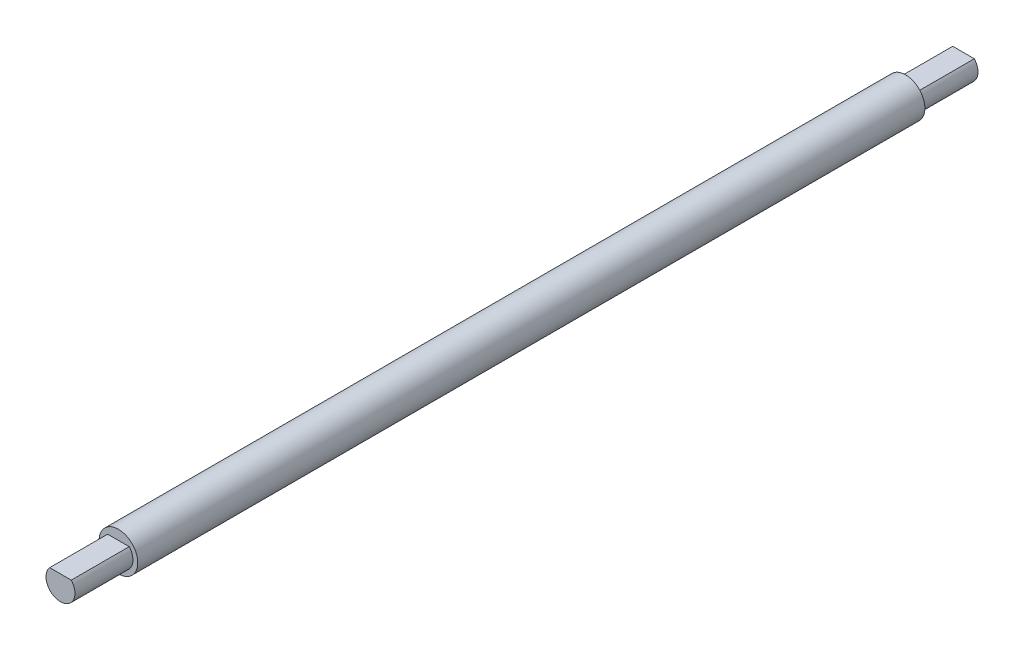
ISO-10303-21;
HEADER;
FILE_DESCRIPTION(('STEP AP214'),'2;1');
FILE_NAME('part.step','',(''),(''),'','','');
FILE_SCHEMA(('AUTOMOTIVE_DESIGN { 1 0 10303 214 1 1 1 1 }'));
ENDSEC;
DATA;
#1=APPLICATION_CONTEXT('core data for automotive mechanical design processes');
#2=APPLICATION_PROTOCOL_DEFINITION('international standard','automotive_design',2000,#1);
#3=PRODUCT_CONTEXT('',#1,'mechanical');
#4=PRODUCT('Part','Part','',(#3));
#5=PRODUCT_RELATED_PRODUCT_CATEGORY('part','',(#4));
#6=PRODUCT_DEFINITION_FORMATION('','',#4);
#7=PRODUCT_DEFINITION_CONTEXT('part definition',#1,'design');
#8=PRODUCT_DEFINITION('design','',#6,#7);
#9=PRODUCT_DEFINITION_SHAPE('','',#8);
#10=(LENGTH_UNIT() NAMED_UNIT(*) SI_UNIT(.MILLI.,.METRE.));
#11=(NAMED_UNIT(*) PLANE_ANGLE_UNIT() SI_UNIT($,.RADIAN.));
#12=(NAMED_UNIT(*) SI_UNIT($,.STERADIAN.) SOLID_ANGLE_UNIT());
#13=UNCERTAINTY_MEASURE_WITH_UNIT(LENGTH_MEASURE(1.E-05),#10,'distance_accuracy_value','');
#14=(GEOMETRIC_REPRESENTATION_CONTEXT(3) GLOBAL_UNCERTAINTY_ASSIGNED_CONTEXT((#13)) GLOBAL_UNIT_ASSIGNED_CONTEXT((#10,
#11,#12)) REPRESENTATION_CONTEXT('',''));
#15=CARTESIAN_POINT('',(0.,0.,0.));
#16=DIRECTION('',(0.,0.,1.));
#17=DIRECTION('',(1.,0.,0.));
#18=AXIS2_PLACEMENT_3D('',#15,#16,#17);
#19=CARTESIAN_POINT('',(0.,0.,0.));
#20=DIRECTION('',(0.,0.,1.));
#21=DIRECTION('',(1.,0.,0.));
#22=AXIS2_PLACEMENT_3D('',#19,#20,#21);
#23=PLANE('',#22);
#24=DIRECTION('',(1.,0.,0.));
#25=VECTOR('',#24,1.);
#26=CARTESIAN_POINT('',(-4.,2.00000000000003,0.));
#27=LINE('',#26,#25);
#28=CARTESIAN_POINT('',(-2.23606797749976,2.00000000000003,0.));
#29=VERTEX_POINT('',#28);
#30=CARTESIAN_POINT('',(2.23606797749976,2.00000000000003,0.));
#31=VERTEX_POINT('',#30);
#32=EDGE_CURVE('E86',#29,#31,#27,.T.);
#33=ORIENTED_EDGE('',*,*,#32,.T.);
#34=CARTESIAN_POINT('',(0.,0.,0.));
#35=DIRECTION('',(0.,0.,-1.));
#36=DIRECTION('',(-1.,0.,0.));
#37=AXIS2_PLACEMENT_3D('',#34,#35,#36);
#38=CIRCLE('',#37,3.);
#39=EDGE_CURVE('E49',#31,#29,#38,.T.);
#40=ORIENTED_EDGE('',*,*,#39,.T.);
#41=EDGE_LOOP('',(#33,#40));
#42=FACE_BOUND('',#41,.T.);
#43=ADVANCED_FACE('F35',(#42),#23,.F.);
#44=CARTESIAN_POINT('',(0.,0.,0.));
#45=DIRECTION('',(0.,0.,1.));
#46=DIRECTION('',(1.,0.,0.));
#47=AXIS2_PLACEMENT_3D('',#44,#45,#46);
#48=CYLINDRICAL_SURFACE('',#47,4.);
#49=CARTESIAN_POINT('',(0.,0.,12.));
#50=DIRECTION('',(0.,0.,1.));
#51=DIRECTION('',(1.,0.,0.));
#52=AXIS2_PLACEMENT_3D('',#49,#50,#51);
#53=CIRCLE('',#52,4.);
#54=CARTESIAN_POINT('',(4.,0.,12.));
#55=VERTEX_POINT('',#54);
#56=EDGE_CURVE('E104',#55,#55,#53,.F.);
#57=ORIENTED_EDGE('',*,*,#56,.F.);
#58=EDGE_LOOP('',(#57));
#59=FACE_BOUND('',#58,.T.);
#60=CARTESIAN_POINT('',(0.,0.,175.));
#61=DIRECTION('',(0.,0.,-1.));
#62=DIRECTION('',(-1.,0.,0.));
#63=AXIS2_PLACEMENT_3D('',#60,#61,#62);
#64=CIRCLE('',#63,4.);
#65=CARTESIAN_POINT('',(-4.,0.,175.));
#66=VERTEX_POINT('',#65);
#67=EDGE_CURVE('E101',#66,#66,#64,.F.);
#68=ORIENTED_EDGE('',*,*,#67,.F.);
#69=EDGE_LOOP('',(#68));
#70=FACE_BOUND('',#69,.T.);
#71=ADVANCED_FACE('F120',(#59,#70),#48,.T.);
#72=CARTESIAN_POINT('',(0.,0.,187.));
#73=DIRECTION('',(0.,0.,1.));
#74=DIRECTION('',(1.,0.,0.));
#75=AXIS2_PLACEMENT_3D('',#72,#73,#74);
#76=PLANE('',#75);
#77=CARTESIAN_POINT('',(0.,0.,187.));
#78=DIRECTION('',(0.,0.,-1.));
#79=DIRECTION('',(-1.,0.,0.));
#80=AXIS2_PLACEMENT_3D('',#77,#78,#79);
#81=CIRCLE('',#80,2.99999999999998);
#82=CARTESIAN_POINT('',(2.23606797749976,2.,187.));
#83=VERTEX_POINT('',#82);
#84=CARTESIAN_POINT('',(-2.23606797749976,2.,187.));
#85=VERTEX_POINT('',#84);
#86=EDGE_CURVE('E81',#83,#85,#81,.T.);
#87=ORIENTED_EDGE('',*,*,#86,.F.);
#88=DIRECTION('',(1.,0.,0.));
#89=VECTOR('',#88,1.);
#90=CARTESIAN_POINT('',(0.,2.,187.));
#91=LINE('',#90,#89);
#92=EDGE_CURVE('E93',#85,#83,#91,.T.);
#93=ORIENTED_EDGE('',*,*,#92,.F.);
#94=EDGE_LOOP('',(#87,#93));
#95=FACE_BOUND('',#94,.T.);
#96=ADVANCED_FACE('F118',(#95),#76,.T.);
#97=CARTESIAN_POINT('',(-4.,2.,175.));
#98=DIRECTION('',(0.,0.,-1.));
#99=DIRECTION('',(-1.,0.,0.));
#100=AXIS2_PLACEMENT_3D('',#97,#98,#99);
#101=PLANE('',#100);
#102=DIRECTION('',(1.,0.,0.));
#103=VECTOR('',#102,1.);
#104=CARTESIAN_POINT('',(-4.,2.,175.));
#105=LINE('',#104,#103);
#106=CARTESIAN_POINT('',(-2.23606797749976,2.,175.));
#107=VERTEX_POINT('',#106);
#108=CARTESIAN_POINT('',(2.23606797749976,2.,175.));
#109=VERTEX_POINT('',#108);
#110=EDGE_CURVE('E89',#107,#109,#105,.T.);
#111=ORIENTED_EDGE('',*,*,#110,.T.);
#112=CARTESIAN_POINT('',(0.,0.,175.));
#113=DIRECTION('',(0.,0.,-1.));
#114=DIRECTION('',(-1.,0.,0.));
#115=AXIS2_PLACEMENT_3D('',#112,#113,#114);
#116=CIRCLE('',#115,2.99999999999998);
#117=EDGE_CURVE('E57',#109,#107,#116,.T.);
#118=ORIENTED_EDGE('',*,*,#117,.T.);
#119=EDGE_LOOP('',(#111,#118));
#120=FACE_BOUND('',#119,.T.);
#121=ORIENTED_EDGE('',*,*,#67,.T.);
#122=EDGE_LOOP('',(#121));
#123=FACE_BOUND('',#122,.T.);
#124=ADVANCED_FACE('F112',(#120,#123),#101,.F.);
#125=CARTESIAN_POINT('',(-4.,2.,187.));
#126=DIRECTION('',(0.,-1.,0.));
#127=DIRECTION('',(0.,0.,-1.));
#128=AXIS2_PLACEMENT_3D('',#125,#126,#127);
#129=PLANE('',#128);
#130=ORIENTED_EDGE('',*,*,#110,.F.);
#131=DIRECTION('',(0.,0.,-1.));
#132=VECTOR('',#131,1.);
#133=CARTESIAN_POINT('',(-2.23606797749976,2.,0.));
#134=LINE('',#133,#132);
#135=EDGE_CURVE('E11',#107,#85,#134,.F.);
#136=ORIENTED_EDGE('',*,*,#135,.T.);
#137=ORIENTED_EDGE('',*,*,#92,.T.);
#138=DIRECTION('',(0.,0.,-1.));
#139=VECTOR('',#138,1.);
#140=CARTESIAN_POINT('',(2.23606797749976,2.,0.));
#141=LINE('',#140,#139);
#142=EDGE_CURVE('E42',#83,#109,#141,.T.);
#143=ORIENTED_EDGE('',*,*,#142,.T.);
#144=EDGE_LOOP('',(#130,#136,#137,#143));
#145=FACE_BOUND('',#144,.T.);
#146=ADVANCED_FACE('F108',(#145),#129,.F.);
#147=CARTESIAN_POINT('',(-4.,2.00000000000003,0.));
#148=DIRECTION('',(0.,-1.,0.));
#149=DIRECTION('',(0.,0.,-1.));
#150=AXIS2_PLACEMENT_3D('',#147,#148,#149);
#151=PLANE('',#150);
#152=ORIENTED_EDGE('',*,*,#32,.F.);
#153=DIRECTION('',(0.,0.,-1.));
#154=VECTOR('',#153,1.);
#155=CARTESIAN_POINT('',(-2.23606797749976,2.00000000000003,0.));
#156=LINE('',#155,#154);
#157=CARTESIAN_POINT('',(-2.23606797749976,2.00000000000003,12.));
#158=VERTEX_POINT('',#157);
#159=EDGE_CURVE('E73',#29,#158,#156,.F.);
#160=ORIENTED_EDGE('',*,*,#159,.T.);
#161=DIRECTION('',(1.,0.,0.));
#162=VECTOR('',#161,1.);
#163=CARTESIAN_POINT('',(-4.,2.00000000000003,12.));
#164=LINE('',#163,#162);
#165=CARTESIAN_POINT('',(2.23606797749976,2.00000000000003,12.));
#166=VERTEX_POINT('',#165);
#167=EDGE_CURVE('E90',#158,#166,#164,.T.);
#168=ORIENTED_EDGE('',*,*,#167,.T.);
#169=DIRECTION('',(0.,0.,-1.));
#170=VECTOR('',#169,1.);
#171=CARTESIAN_POINT('',(2.23606797749976,2.00000000000003,0.));
#172=LINE('',#171,#170);
#173=EDGE_CURVE('E82',#166,#31,#172,.T.);
#174=ORIENTED_EDGE('',*,*,#173,.T.);
#175=EDGE_LOOP('',(#152,#160,#168,#174));
#176=FACE_BOUND('',#175,.T.);
#177=ADVANCED_FACE('F88',(#176),#151,.F.);
#178=CARTESIAN_POINT('',(-4.,2.00000000000003,12.));
#179=DIRECTION('',(0.,0.,1.));
#180=DIRECTION('',(1.,0.,0.));
#181=AXIS2_PLACEMENT_3D('',#178,#179,#180);
#182=PLANE('',#181);
#183=ORIENTED_EDGE('',*,*,#56,.T.);
#184=EDGE_LOOP('',(#183));
#185=FACE_BOUND('',#184,.T.);
#186=ORIENTED_EDGE('',*,*,#167,.F.);
#187=CARTESIAN_POINT('',(0.,0.,12.));
#188=DIRECTION('',(0.,0.,-1.));
#189=DIRECTION('',(-1.,0.,0.));
#190=AXIS2_PLACEMENT_3D('',#187,#188,#189);
#191=CIRCLE('',#190,3.);
#192=EDGE_CURVE('E76',#166,#158,#191,.T.);
#193=ORIENTED_EDGE('',*,*,#192,.F.);
#194=EDGE_LOOP('',(#186,#193));
#195=FACE_BOUND('',#194,.T.);
#196=ADVANCED_FACE('F165',(#185,#195),#182,.F.);
#197=CARTESIAN_POINT('',(0.,0.,0.));
#198=DIRECTION('',(0.,0.,-1.));
#199=DIRECTION('',(-1.,0.,0.));
#200=AXIS2_PLACEMENT_3D('',#197,#198,#199);
#201=CYLINDRICAL_SURFACE('',#200,2.99999999999998);
#202=ORIENTED_EDGE('',*,*,#117,.F.);
#203=ORIENTED_EDGE('',*,*,#142,.F.);
#204=ORIENTED_EDGE('',*,*,#86,.T.);
#205=ORIENTED_EDGE('',*,*,#135,.F.);
#206=EDGE_LOOP('',(#202,#203,#204,#205));
#207=FACE_BOUND('',#206,.T.);
#208=ADVANCED_FACE('F116',(#207),#201,.T.);
#209=CARTESIAN_POINT('',(0.,0.,0.));
#210=DIRECTION('',(0.,0.,-1.));
#211=DIRECTION('',(-1.,0.,0.));
#212=AXIS2_PLACEMENT_3D('',#209,#210,#211);
#213=CYLINDRICAL_SURFACE('',#212,3.);
#214=ORIENTED_EDGE('',*,*,#39,.F.);
#215=ORIENTED_EDGE('',*,*,#173,.F.);
#216=ORIENTED_EDGE('',*,*,#192,.T.);
#217=ORIENTED_EDGE('',*,*,#159,.F.);
#218=EDGE_LOOP('',(#214,#215,#216,#217));
#219=FACE_BOUND('',#218,.T.);
#220=ADVANCED_FACE('F74',(#219),#213,.T.);
#221=CLOSED_SHELL('',(#43,#71,#96,#124,#146,#177,#196,#208,#220));
#222=MANIFOLD_SOLID_BREP('B2',#221);
#223=ADVANCED_BREP_SHAPE_REPRESENTATION('',(#18,#222),#14);
#224=SHAPE_DEFINITION_REPRESENTATION(#9,#223);
ENDSEC;
END-ISO-10303-21;
